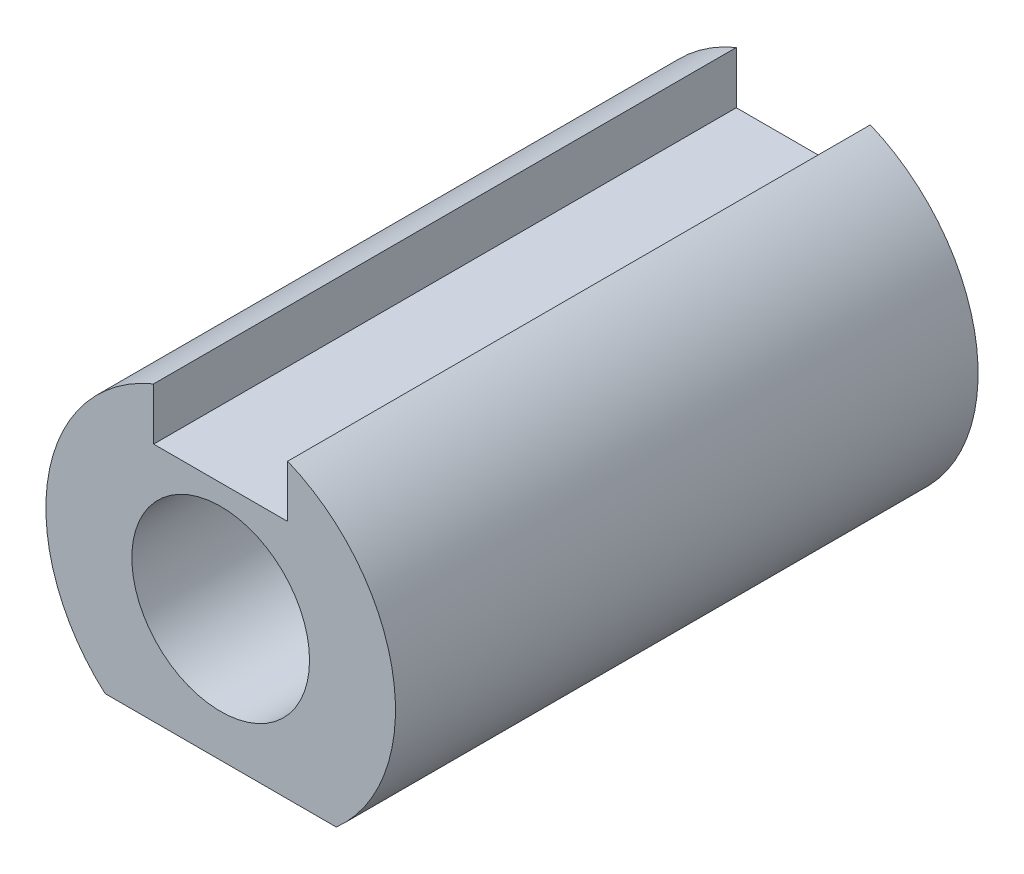
ISO-10303-21;
HEADER;
FILE_DESCRIPTION(('STEP AP214'),'2;1');
FILE_NAME('part.step','',(''),(''),'','','');
FILE_SCHEMA(('AUTOMOTIVE_DESIGN { 1 0 10303 214 1 1 1 1 }'));
ENDSEC;
DATA;
#1=APPLICATION_CONTEXT('core data for automotive mechanical design processes');
#2=APPLICATION_PROTOCOL_DEFINITION('international standard','automotive_design',2000,#1);
#3=PRODUCT_CONTEXT('',#1,'mechanical');
#4=PRODUCT('Part','Part','',(#3));
#5=PRODUCT_RELATED_PRODUCT_CATEGORY('part','',(#4));
#6=PRODUCT_DEFINITION_FORMATION('','',#4);
#7=PRODUCT_DEFINITION_CONTEXT('part definition',#1,'design');
#8=PRODUCT_DEFINITION('design','',#6,#7);
#9=PRODUCT_DEFINITION_SHAPE('','',#8);
#10=(LENGTH_UNIT() NAMED_UNIT(*) SI_UNIT(.MILLI.,.METRE.));
#11=(NAMED_UNIT(*) PLANE_ANGLE_UNIT() SI_UNIT($,.RADIAN.));
#12=(NAMED_UNIT(*) SI_UNIT($,.STERADIAN.) SOLID_ANGLE_UNIT());
#13=UNCERTAINTY_MEASURE_WITH_UNIT(LENGTH_MEASURE(1.E-05),#10,'distance_accuracy_value','');
#14=(GEOMETRIC_REPRESENTATION_CONTEXT(3) GLOBAL_UNCERTAINTY_ASSIGNED_CONTEXT((#13)) GLOBAL_UNIT_ASSIGNED_CONTEXT((#10,
#11,#12)) REPRESENTATION_CONTEXT('',''));
#15=CARTESIAN_POINT('',(0.,0.,0.));
#16=DIRECTION('',(0.,0.,1.));
#17=DIRECTION('',(1.,0.,0.));
#18=AXIS2_PLACEMENT_3D('',#15,#16,#17);
#19=CARTESIAN_POINT('',(0.,0.,20.));
#20=DIRECTION('',(0.,0.,-1.));
#21=DIRECTION('',(0.,-1.,0.));
#22=AXIS2_PLACEMENT_3D('',#19,#20,#21);
#23=CYLINDRICAL_SURFACE('',#22,6.);
#24=CARTESIAN_POINT('',(0.,0.,20.));
#25=DIRECTION('',(0.,0.,1.));
#26=DIRECTION('',(1.,0.,0.));
#27=AXIS2_PLACEMENT_3D('',#24,#25,#26);
#28=CIRCLE('',#27,6.);
#29=CARTESIAN_POINT('',(3.96862696659687,-4.5,20.));
#30=VERTEX_POINT('',#29);
#31=CARTESIAN_POINT('',(2.3,5.54166040099896,20.));
#32=VERTEX_POINT('',#31);
#33=EDGE_CURVE('E33',#30,#32,#28,.T.);
#34=ORIENTED_EDGE('',*,*,#33,.F.);
#35=DIRECTION('',(0.,0.,-1.));
#36=VECTOR('',#35,1.);
#37=CARTESIAN_POINT('',(3.96862696659687,-4.5,20.));
#38=LINE('',#37,#36);
#39=CARTESIAN_POINT('',(3.96862696659687,-4.5,0.));
#40=VERTEX_POINT('',#39);
#41=EDGE_CURVE('E9',#30,#40,#38,.T.);
#42=ORIENTED_EDGE('',*,*,#41,.T.);
#43=CARTESIAN_POINT('',(0.,0.,0.));
#44=DIRECTION('',(0.,0.,1.));
#45=DIRECTION('',(1.,0.,0.));
#46=AXIS2_PLACEMENT_3D('',#43,#44,#45);
#47=CIRCLE('',#46,6.);
#48=CARTESIAN_POINT('',(2.3,5.54166040099896,0.));
#49=VERTEX_POINT('',#48);
#50=EDGE_CURVE('E25',#40,#49,#47,.T.);
#51=ORIENTED_EDGE('',*,*,#50,.T.);
#52=DIRECTION('',(0.,0.,1.));
#53=VECTOR('',#52,1.);
#54=CARTESIAN_POINT('',(2.3,5.54166040099896,20.));
#55=LINE('',#54,#53);
#56=EDGE_CURVE('E76',#49,#32,#55,.T.);
#57=ORIENTED_EDGE('',*,*,#56,.T.);
#58=EDGE_LOOP('',(#34,#42,#51,#57));
#59=FACE_BOUND('',#58,.T.);
#60=ADVANCED_FACE('F15',(#59),#23,.T.);
#61=CARTESIAN_POINT('',(0.,0.,20.));
#62=DIRECTION('',(0.,0.,1.));
#63=DIRECTION('',(1.,0.,0.));
#64=AXIS2_PLACEMENT_3D('',#61,#62,#63);
#65=PLANE('',#64);
#66=DIRECTION('',(-1.,0.,0.));
#67=VECTOR('',#66,1.);
#68=CARTESIAN_POINT('',(3.96862696659687,-4.5,20.));
#69=LINE('',#68,#67);
#70=CARTESIAN_POINT('',(-3.96862696659687,-4.5,20.));
#71=VERTEX_POINT('',#70);
#72=EDGE_CURVE('E117',#30,#71,#69,.T.);
#73=ORIENTED_EDGE('',*,*,#72,.F.);
#74=ORIENTED_EDGE('',*,*,#33,.T.);
#75=DIRECTION('',(0.,1.,0.));
#76=VECTOR('',#75,1.);
#77=CARTESIAN_POINT('',(2.3,3.75,20.));
#78=LINE('',#77,#76);
#79=CARTESIAN_POINT('',(2.3,3.75,20.));
#80=VERTEX_POINT('',#79);
#81=EDGE_CURVE('E91',#80,#32,#78,.T.);
#82=ORIENTED_EDGE('',*,*,#81,.F.);
#83=DIRECTION('',(1.,0.,0.));
#84=VECTOR('',#83,1.);
#85=CARTESIAN_POINT('',(-2.3,3.75,20.));
#86=LINE('',#85,#84);
#87=CARTESIAN_POINT('',(-2.3,3.75,20.));
#88=VERTEX_POINT('',#87);
#89=EDGE_CURVE('E88',#88,#80,#86,.T.);
#90=ORIENTED_EDGE('',*,*,#89,.F.);
#91=DIRECTION('',(0.,-1.,0.));
#92=VECTOR('',#91,1.);
#93=CARTESIAN_POINT('',(-2.3,5.54166040099896,20.));
#94=LINE('',#93,#92);
#95=CARTESIAN_POINT('',(-2.3,5.54166040099896,20.));
#96=VERTEX_POINT('',#95);
#97=EDGE_CURVE('E95',#96,#88,#94,.T.);
#98=ORIENTED_EDGE('',*,*,#97,.F.);
#99=CARTESIAN_POINT('',(0.,0.,20.));
#100=DIRECTION('',(0.,0.,1.));
#101=DIRECTION('',(1.,0.,0.));
#102=AXIS2_PLACEMENT_3D('',#99,#100,#101);
#103=CIRCLE('',#102,6.);
#104=EDGE_CURVE('E110',#96,#71,#103,.T.);
#105=ORIENTED_EDGE('',*,*,#104,.T.);
#106=EDGE_LOOP('',(#73,#74,#82,#90,#98,#105));
#107=FACE_BOUND('',#106,.T.);
#108=CARTESIAN_POINT('',(0.,0.,20.));
#109=DIRECTION('',(0.,0.,1.));
#110=DIRECTION('',(1.,0.,0.));
#111=AXIS2_PLACEMENT_3D('',#108,#109,#110);
#112=CIRCLE('',#111,3.05);
#113=CARTESIAN_POINT('',(3.05,0.,20.));
#114=VERTEX_POINT('',#113);
#115=EDGE_CURVE('E90',#114,#114,#112,.T.);
#116=ORIENTED_EDGE('',*,*,#115,.F.);
#117=EDGE_LOOP('',(#116));
#118=FACE_BOUND('',#117,.T.);
#119=ADVANCED_FACE('F123',(#107,#118),#65,.T.);
#120=CARTESIAN_POINT('',(0.,0.,0.));
#121=DIRECTION('',(0.,0.,1.));
#122=DIRECTION('',(1.,0.,0.));
#123=AXIS2_PLACEMENT_3D('',#120,#121,#122);
#124=PLANE('',#123);
#125=ORIENTED_EDGE('',*,*,#50,.F.);
#126=DIRECTION('',(-1.,0.,0.));
#127=VECTOR('',#126,1.);
#128=CARTESIAN_POINT('',(3.96862696659687,-4.5,0.));
#129=LINE('',#128,#127);
#130=CARTESIAN_POINT('',(-3.96862696659687,-4.5,0.));
#131=VERTEX_POINT('',#130);
#132=EDGE_CURVE('E107',#40,#131,#129,.T.);
#133=ORIENTED_EDGE('',*,*,#132,.T.);
#134=CARTESIAN_POINT('',(0.,0.,0.));
#135=DIRECTION('',(0.,0.,1.));
#136=DIRECTION('',(1.,0.,0.));
#137=AXIS2_PLACEMENT_3D('',#134,#135,#136);
#138=CIRCLE('',#137,6.);
#139=CARTESIAN_POINT('',(-2.3,5.54166040099896,0.));
#140=VERTEX_POINT('',#139);
#141=EDGE_CURVE('E103',#140,#131,#138,.T.);
#142=ORIENTED_EDGE('',*,*,#141,.F.);
#143=DIRECTION('',(0.,-1.,0.));
#144=VECTOR('',#143,1.);
#145=CARTESIAN_POINT('',(-2.3,5.54166040099896,0.));
#146=LINE('',#145,#144);
#147=CARTESIAN_POINT('',(-2.3,3.75,0.));
#148=VERTEX_POINT('',#147);
#149=EDGE_CURVE('E84',#140,#148,#146,.T.);
#150=ORIENTED_EDGE('',*,*,#149,.T.);
#151=DIRECTION('',(1.,0.,0.));
#152=VECTOR('',#151,1.);
#153=CARTESIAN_POINT('',(-2.3,3.75,0.));
#154=LINE('',#153,#152);
#155=CARTESIAN_POINT('',(2.3,3.75,0.));
#156=VERTEX_POINT('',#155);
#157=EDGE_CURVE('E66',#148,#156,#154,.T.);
#158=ORIENTED_EDGE('',*,*,#157,.T.);
#159=DIRECTION('',(0.,1.,0.));
#160=VECTOR('',#159,1.);
#161=CARTESIAN_POINT('',(2.3,3.75,0.));
#162=LINE('',#161,#160);
#163=EDGE_CURVE('E72',#156,#49,#162,.T.);
#164=ORIENTED_EDGE('',*,*,#163,.T.);
#165=EDGE_LOOP('',(#125,#133,#142,#150,#158,#164));
#166=FACE_BOUND('',#165,.T.);
#167=CARTESIAN_POINT('',(0.,0.,0.));
#168=DIRECTION('',(0.,0.,1.));
#169=DIRECTION('',(1.,0.,0.));
#170=AXIS2_PLACEMENT_3D('',#167,#168,#169);
#171=CIRCLE('',#170,3.05);
#172=CARTESIAN_POINT('',(3.05,0.,0.));
#173=VERTEX_POINT('',#172);
#174=EDGE_CURVE('E79',#173,#173,#171,.T.);
#175=ORIENTED_EDGE('',*,*,#174,.T.);
#176=EDGE_LOOP('',(#175));
#177=FACE_BOUND('',#176,.T.);
#178=ADVANCED_FACE('F81',(#166,#177),#124,.F.);
#179=CARTESIAN_POINT('',(0.,0.,20.));
#180=DIRECTION('',(0.,0.,-1.));
#181=DIRECTION('',(0.,-1.,0.));
#182=AXIS2_PLACEMENT_3D('',#179,#180,#181);
#183=CYLINDRICAL_SURFACE('',#182,6.);
#184=ORIENTED_EDGE('',*,*,#141,.T.);
#185=DIRECTION('',(0.,0.,1.));
#186=VECTOR('',#185,1.);
#187=CARTESIAN_POINT('',(-3.96862696659687,-4.5,20.));
#188=LINE('',#187,#186);
#189=EDGE_CURVE('E100',#131,#71,#188,.T.);
#190=ORIENTED_EDGE('',*,*,#189,.T.);
#191=ORIENTED_EDGE('',*,*,#104,.F.);
#192=DIRECTION('',(0.,0.,-1.));
#193=VECTOR('',#192,1.);
#194=CARTESIAN_POINT('',(-2.3,5.54166040099896,20.));
#195=LINE('',#194,#193);
#196=EDGE_CURVE('E93',#96,#140,#195,.T.);
#197=ORIENTED_EDGE('',*,*,#196,.T.);
#198=EDGE_LOOP('',(#184,#190,#191,#197));
#199=FACE_BOUND('',#198,.T.);
#200=ADVANCED_FACE('F17',(#199),#183,.T.);
#201=CARTESIAN_POINT('',(0.,0.,20.));
#202=DIRECTION('',(0.,0.,-1.));
#203=DIRECTION('',(0.,-1.,0.));
#204=AXIS2_PLACEMENT_3D('',#201,#202,#203);
#205=CYLINDRICAL_SURFACE('',#204,3.05);
#206=ORIENTED_EDGE('',*,*,#115,.T.);
#207=EDGE_LOOP('',(#206));
#208=FACE_BOUND('',#207,.T.);
#209=ORIENTED_EDGE('',*,*,#174,.F.);
#210=EDGE_LOOP('',(#209));
#211=FACE_BOUND('',#210,.T.);
#212=ADVANCED_FACE('F142',(#208,#211),#205,.F.);
#213=CARTESIAN_POINT('',(2.3,6.29316109321346,0.));
#214=DIRECTION('',(1.,0.,0.));
#215=DIRECTION('',(0.,0.,-1.));
#216=AXIS2_PLACEMENT_3D('',#213,#214,#215);
#217=PLANE('',#216);
#218=ORIENTED_EDGE('',*,*,#163,.F.);
#219=DIRECTION('',(0.,0.,1.));
#220=VECTOR('',#219,1.);
#221=CARTESIAN_POINT('',(2.3,3.75,0.));
#222=LINE('',#221,#220);
#223=EDGE_CURVE('E75',#156,#80,#222,.T.);
#224=ORIENTED_EDGE('',*,*,#223,.T.);
#225=ORIENTED_EDGE('',*,*,#81,.T.);
#226=ORIENTED_EDGE('',*,*,#56,.F.);
#227=EDGE_LOOP('',(#218,#224,#225,#226));
#228=FACE_BOUND('',#227,.T.);
#229=ADVANCED_FACE('F73',(#228),#217,.F.);
#230=CARTESIAN_POINT('',(-2.3,6.29316109321346,0.));
#231=DIRECTION('',(-1.,0.,0.));
#232=DIRECTION('',(0.,0.,1.));
#233=AXIS2_PLACEMENT_3D('',#230,#231,#232);
#234=PLANE('',#233);
#235=ORIENTED_EDGE('',*,*,#97,.T.);
#236=DIRECTION('',(0.,0.,1.));
#237=VECTOR('',#236,1.);
#238=CARTESIAN_POINT('',(-2.3,3.75,0.));
#239=LINE('',#238,#237);
#240=EDGE_CURVE('E19',#148,#88,#239,.T.);
#241=ORIENTED_EDGE('',*,*,#240,.F.);
#242=ORIENTED_EDGE('',*,*,#149,.F.);
#243=ORIENTED_EDGE('',*,*,#196,.F.);
#244=EDGE_LOOP('',(#235,#241,#242,#243));
#245=FACE_BOUND('',#244,.T.);
#246=ADVANCED_FACE('F133',(#245),#234,.F.);
#247=CARTESIAN_POINT('',(2.3,3.75,0.));
#248=DIRECTION('',(0.,-1.,0.));
#249=DIRECTION('',(1.,0.,0.));
#250=AXIS2_PLACEMENT_3D('',#247,#248,#249);
#251=PLANE('',#250);
#252=ORIENTED_EDGE('',*,*,#89,.T.);
#253=ORIENTED_EDGE('',*,*,#223,.F.);
#254=ORIENTED_EDGE('',*,*,#157,.F.);
#255=ORIENTED_EDGE('',*,*,#240,.T.);
#256=EDGE_LOOP('',(#252,#253,#254,#255));
#257=FACE_BOUND('',#256,.T.);
#258=ADVANCED_FACE('F87',(#257),#251,.F.);
#259=CARTESIAN_POINT('',(-5.1564219973424,-4.5,-21.));
#260=DIRECTION('',(0.,1.,0.));
#261=DIRECTION('',(0.,0.,1.));
#262=AXIS2_PLACEMENT_3D('',#259,#260,#261);
#263=PLANE('',#262);
#264=ORIENTED_EDGE('',*,*,#72,.T.);
#265=ORIENTED_EDGE('',*,*,#189,.F.);
#266=ORIENTED_EDGE('',*,*,#132,.F.);
#267=ORIENTED_EDGE('',*,*,#41,.F.);
#268=EDGE_LOOP('',(#264,#265,#266,#267));
#269=FACE_BOUND('',#268,.T.);
#270=ADVANCED_FACE('F128',(#269),#263,.F.);
#271=CLOSED_SHELL('',(#60,#119,#178,#200,#212,#229,#246,#258,#270));
#272=MANIFOLD_SOLID_BREP('B1',#271);
#273=ADVANCED_BREP_SHAPE_REPRESENTATION('',(#18,#272),#14);
#274=SHAPE_DEFINITION_REPRESENTATION(#9,#273);
ENDSEC;
END-ISO-10303-21;
